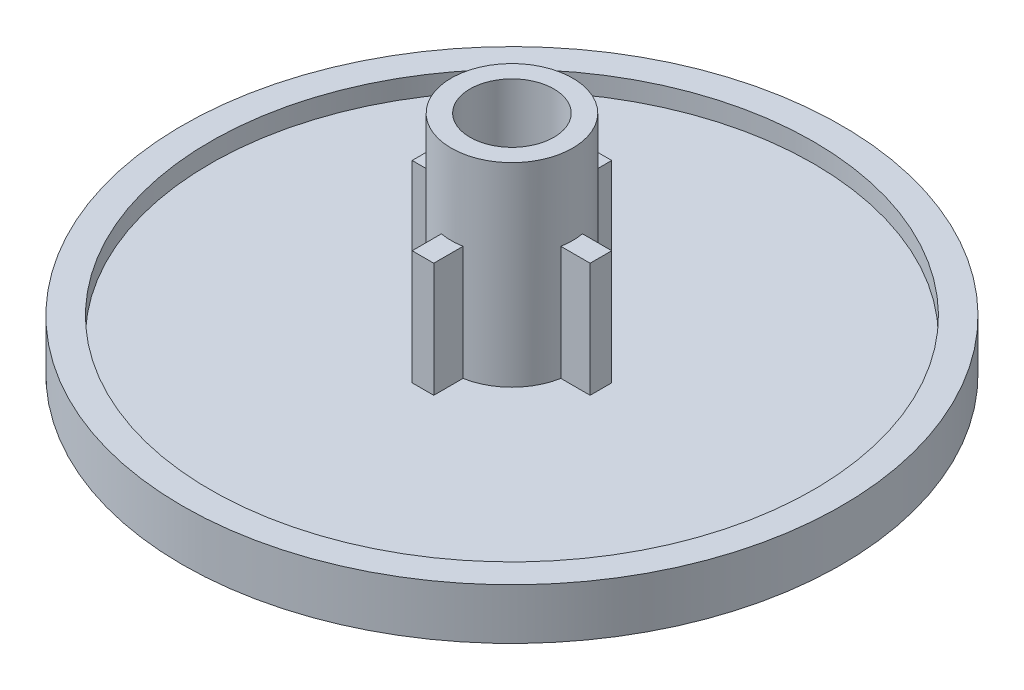
ISO-10303-21;
HEADER;
FILE_DESCRIPTION(('STEP AP214'),'2;1');
FILE_NAME('part.step','',(''),(''),'','','');
FILE_SCHEMA(('AUTOMOTIVE_DESIGN { 1 0 10303 214 1 1 1 1 }'));
ENDSEC;
DATA;
#1=APPLICATION_CONTEXT('core data for automotive mechanical design processes');
#2=APPLICATION_PROTOCOL_DEFINITION('international standard','automotive_design',2000,#1);
#3=PRODUCT_CONTEXT('',#1,'mechanical');
#4=PRODUCT('Part','Part','',(#3));
#5=PRODUCT_RELATED_PRODUCT_CATEGORY('part','',(#4));
#6=PRODUCT_DEFINITION_FORMATION('','',#4);
#7=PRODUCT_DEFINITION_CONTEXT('part definition',#1,'design');
#8=PRODUCT_DEFINITION('design','',#6,#7);
#9=PRODUCT_DEFINITION_SHAPE('','',#8);
#10=(LENGTH_UNIT() NAMED_UNIT(*) SI_UNIT(.MILLI.,.METRE.));
#11=(NAMED_UNIT(*) PLANE_ANGLE_UNIT() SI_UNIT($,.RADIAN.));
#12=(NAMED_UNIT(*) SI_UNIT($,.STERADIAN.) SOLID_ANGLE_UNIT());
#13=UNCERTAINTY_MEASURE_WITH_UNIT(LENGTH_MEASURE(1.E-05),#10,'distance_accuracy_value','');
#14=(GEOMETRIC_REPRESENTATION_CONTEXT(3) GLOBAL_UNCERTAINTY_ASSIGNED_CONTEXT((#13)) GLOBAL_UNIT_ASSIGNED_CONTEXT((#10,
#11,#12)) REPRESENTATION_CONTEXT('',''));
#15=CARTESIAN_POINT('',(0.,0.,0.));
#16=DIRECTION('',(0.,0.,1.));
#17=DIRECTION('',(1.,0.,0.));
#18=AXIS2_PLACEMENT_3D('',#15,#16,#17);
#19=CARTESIAN_POINT('',(0.,1.27,0.));
#20=DIRECTION('',(0.,1.,0.));
#21=DIRECTION('',(0.,0.,1.));
#22=AXIS2_PLACEMENT_3D('',#19,#20,#21);
#23=PLANE('',#22);
#24=CARTESIAN_POINT('',(0.,1.27,0.));
#25=DIRECTION('',(0.,1.,0.));
#26=DIRECTION('',(0.,0.,1.));
#27=AXIS2_PLACEMENT_3D('',#24,#25,#26);
#28=CIRCLE('',#27,12.0523);
#29=CARTESIAN_POINT('',(0.,1.27,-12.0523));
#30=VERTEX_POINT('',#29);
#31=EDGE_CURVE('E253',#30,#30,#28,.F.);
#32=ORIENTED_EDGE('',*,*,#31,.F.);
#33=EDGE_LOOP('',(#32));
#34=FACE_BOUND('',#33,.T.);
#35=DIRECTION('',(1.,0.,0.));
#36=VECTOR('',#35,1.);
#37=CARTESIAN_POINT('',(0.,1.27,-3.556));
#38=LINE('',#37,#36);
#39=CARTESIAN_POINT('',(-0.4318,1.27,-3.556));
#40=VERTEX_POINT('',#39);
#41=CARTESIAN_POINT('',(0.4318,1.27,-3.556));
#42=VERTEX_POINT('',#41);
#43=EDGE_CURVE('E199',#40,#42,#38,.T.);
#44=ORIENTED_EDGE('',*,*,#43,.T.);
#45=DIRECTION('',(0.,0.,1.));
#46=VECTOR('',#45,1.);
#47=CARTESIAN_POINT('',(0.4318,1.27,0.));
#48=LINE('',#47,#46);
#49=CARTESIAN_POINT('',(0.4318,1.27,-2.38695815840999));
#50=VERTEX_POINT('',#49);
#51=EDGE_CURVE('E156',#42,#50,#48,.T.);
#52=ORIENTED_EDGE('',*,*,#51,.T.);
#53=CARTESIAN_POINT('',(0.,1.27,0.));
#54=DIRECTION('',(0.,1.,0.));
#55=DIRECTION('',(0.,0.,1.));
#56=AXIS2_PLACEMENT_3D('',#53,#54,#55);
#57=CIRCLE('',#56,2.4257);
#58=CARTESIAN_POINT('',(2.38695815840999,1.27,-0.4318));
#59=VERTEX_POINT('',#58);
#60=EDGE_CURVE('E239',#59,#50,#57,.T.);
#61=ORIENTED_EDGE('',*,*,#60,.F.);
#62=DIRECTION('',(-1.,0.,0.));
#63=VECTOR('',#62,1.);
#64=CARTESIAN_POINT('',(0.,1.27,-0.4318));
#65=LINE('',#64,#63);
#66=CARTESIAN_POINT('',(3.556,1.27,-0.4318));
#67=VERTEX_POINT('',#66);
#68=EDGE_CURVE('E230',#67,#59,#65,.T.);
#69=ORIENTED_EDGE('',*,*,#68,.F.);
#70=DIRECTION('',(0.,0.,1.));
#71=VECTOR('',#70,1.);
#72=CARTESIAN_POINT('',(3.556,1.27,0.));
#73=LINE('',#72,#71);
#74=CARTESIAN_POINT('',(3.556,1.27,0.4318));
#75=VERTEX_POINT('',#74);
#76=EDGE_CURVE('E273',#67,#75,#73,.T.);
#77=ORIENTED_EDGE('',*,*,#76,.T.);
#78=DIRECTION('',(-1.,0.,0.));
#79=VECTOR('',#78,1.);
#80=CARTESIAN_POINT('',(0.,1.27,0.4318));
#81=LINE('',#80,#79);
#82=CARTESIAN_POINT('',(2.38695815840999,1.27,0.4318));
#83=VERTEX_POINT('',#82);
#84=EDGE_CURVE('E234',#75,#83,#81,.T.);
#85=ORIENTED_EDGE('',*,*,#84,.T.);
#86=CARTESIAN_POINT('',(0.4318,1.27,2.38695815840999));
#87=VERTEX_POINT('',#86);
#88=EDGE_CURVE('E244',#87,#83,#57,.T.);
#89=ORIENTED_EDGE('',*,*,#88,.F.);
#90=CARTESIAN_POINT('',(0.4318,1.27,3.556));
#91=VERTEX_POINT('',#90);
#92=EDGE_CURVE('E194',#87,#91,#48,.T.);
#93=ORIENTED_EDGE('',*,*,#92,.T.);
#94=DIRECTION('',(-1.,0.,0.));
#95=VECTOR('',#94,1.);
#96=CARTESIAN_POINT('',(0.,1.27,3.556));
#97=LINE('',#96,#95);
#98=CARTESIAN_POINT('',(-0.4318,1.27,3.556));
#99=VERTEX_POINT('',#98);
#100=EDGE_CURVE('E201',#91,#99,#97,.T.);
#101=ORIENTED_EDGE('',*,*,#100,.T.);
#102=DIRECTION('',(0.,0.,1.));
#103=VECTOR('',#102,1.);
#104=CARTESIAN_POINT('',(-0.4318,1.27,0.));
#105=LINE('',#104,#103);
#106=CARTESIAN_POINT('',(-0.4318,1.27,2.38695815840999));
#107=VERTEX_POINT('',#106);
#108=EDGE_CURVE('E188',#107,#99,#105,.T.);
#109=ORIENTED_EDGE('',*,*,#108,.F.);
#110=CARTESIAN_POINT('',(-2.38695815840999,1.27,0.4318));
#111=VERTEX_POINT('',#110);
#112=EDGE_CURVE('E240',#111,#107,#57,.T.);
#113=ORIENTED_EDGE('',*,*,#112,.F.);
#114=CARTESIAN_POINT('',(-3.556,1.27,0.4318));
#115=VERTEX_POINT('',#114);
#116=EDGE_CURVE('E231',#111,#115,#81,.T.);
#117=ORIENTED_EDGE('',*,*,#116,.T.);
#118=DIRECTION('',(0.,0.,-1.));
#119=VECTOR('',#118,1.);
#120=CARTESIAN_POINT('',(-3.556,1.27,0.));
#121=LINE('',#120,#119);
#122=CARTESIAN_POINT('',(-3.556,1.27,-0.4318));
#123=VERTEX_POINT('',#122);
#124=EDGE_CURVE('E271',#115,#123,#121,.T.);
#125=ORIENTED_EDGE('',*,*,#124,.T.);
#126=CARTESIAN_POINT('',(-2.38695815840999,1.27,-0.4318));
#127=VERTEX_POINT('',#126);
#128=EDGE_CURVE('E228',#127,#123,#65,.T.);
#129=ORIENTED_EDGE('',*,*,#128,.F.);
#130=CARTESIAN_POINT('',(-0.4318,1.27,-2.38695815840999));
#131=VERTEX_POINT('',#130);
#132=EDGE_CURVE('E243',#131,#127,#57,.T.);
#133=ORIENTED_EDGE('',*,*,#132,.F.);
#134=EDGE_CURVE('E59',#40,#131,#105,.T.);
#135=ORIENTED_EDGE('',*,*,#134,.F.);
#136=EDGE_LOOP('',(#44,#52,#61,#69,#77,#85,#89,#93,#101,#109,#113,#117,#125,#129,#133,#135));
#137=FACE_BOUND('',#136,.T.);
#138=ADVANCED_FACE('F36',(#34,#137),#23,.T.);
#139=CARTESIAN_POINT('',(0.,9.0424,0.));
#140=DIRECTION('',(0.,-1.,0.));
#141=DIRECTION('',(0.,0.,-1.));
#142=AXIS2_PLACEMENT_3D('',#139,#140,#141);
#143=CYLINDRICAL_SURFACE('',#142,2.4257);
#144=CARTESIAN_POINT('',(0.,9.0424,0.));
#145=DIRECTION('',(0.,1.,0.));
#146=DIRECTION('',(0.,0.,1.));
#147=AXIS2_PLACEMENT_3D('',#144,#145,#146);
#148=CIRCLE('',#147,2.4257);
#149=CARTESIAN_POINT('',(0.,9.0424,2.4257));
#150=VERTEX_POINT('',#149);
#151=EDGE_CURVE('E235',#150,#150,#148,.T.);
#152=ORIENTED_EDGE('',*,*,#151,.F.);
#153=EDGE_LOOP('',(#152));
#154=FACE_BOUND('',#153,.T.);
#155=DIRECTION('',(0.,-1.,0.));
#156=VECTOR('',#155,1.);
#157=CARTESIAN_POINT('',(0.4318,9.0424,-2.38695815840999));
#158=LINE('',#157,#156);
#159=CARTESIAN_POINT('',(0.4318,5.842,-2.38695815840999));
#160=VERTEX_POINT('',#159);
#161=EDGE_CURVE('E197',#160,#50,#158,.T.);
#162=ORIENTED_EDGE('',*,*,#161,.F.);
#163=CARTESIAN_POINT('',(0.,5.842,0.));
#164=DIRECTION('',(0.,-1.,0.));
#165=DIRECTION('',(0.,0.,-1.));
#166=AXIS2_PLACEMENT_3D('',#163,#164,#165);
#167=CIRCLE('',#166,2.4257);
#168=CARTESIAN_POINT('',(-0.4318,5.842,-2.38695815840999));
#169=VERTEX_POINT('',#168);
#170=EDGE_CURVE('E11',#169,#160,#167,.T.);
#171=ORIENTED_EDGE('',*,*,#170,.F.);
#172=DIRECTION('',(0.,-1.,0.));
#173=VECTOR('',#172,1.);
#174=CARTESIAN_POINT('',(-0.4318,9.0424,-2.38695815840999));
#175=LINE('',#174,#173);
#176=EDGE_CURVE('E190',#169,#131,#175,.T.);
#177=ORIENTED_EDGE('',*,*,#176,.T.);
#178=ORIENTED_EDGE('',*,*,#132,.T.);
#179=DIRECTION('',(0.,-1.,0.));
#180=VECTOR('',#179,1.);
#181=CARTESIAN_POINT('',(-2.38695815840999,9.0424,-0.4318));
#182=LINE('',#181,#180);
#183=CARTESIAN_POINT('',(-2.38695815840999,5.842,-0.4318));
#184=VERTEX_POINT('',#183);
#185=EDGE_CURVE('E256',#127,#184,#182,.F.);
#186=ORIENTED_EDGE('',*,*,#185,.T.);
#187=CARTESIAN_POINT('',(0.,5.842,0.));
#188=DIRECTION('',(0.,-1.,0.));
#189=DIRECTION('',(0.,0.,-1.));
#190=AXIS2_PLACEMENT_3D('',#187,#188,#189);
#191=CIRCLE('',#190,2.4257);
#192=CARTESIAN_POINT('',(-2.38695815840999,5.842,0.4318));
#193=VERTEX_POINT('',#192);
#194=EDGE_CURVE('E259',#193,#184,#191,.T.);
#195=ORIENTED_EDGE('',*,*,#194,.F.);
#196=DIRECTION('',(0.,-1.,0.));
#197=VECTOR('',#196,1.);
#198=CARTESIAN_POINT('',(-2.38695815840999,9.0424,0.4318));
#199=LINE('',#198,#197);
#200=EDGE_CURVE('E262',#111,#193,#199,.F.);
#201=ORIENTED_EDGE('',*,*,#200,.F.);
#202=ORIENTED_EDGE('',*,*,#112,.T.);
#203=DIRECTION('',(0.,-1.,0.));
#204=VECTOR('',#203,1.);
#205=CARTESIAN_POINT('',(-0.4318,9.0424,2.38695815840999));
#206=LINE('',#205,#204);
#207=CARTESIAN_POINT('',(-0.4318,5.842,2.38695815840999));
#208=VERTEX_POINT('',#207);
#209=EDGE_CURVE('E169',#107,#208,#206,.F.);
#210=ORIENTED_EDGE('',*,*,#209,.T.);
#211=CARTESIAN_POINT('',(0.4318,5.842,2.38695815840999));
#212=VERTEX_POINT('',#211);
#213=EDGE_CURVE('E40',#212,#208,#167,.T.);
#214=ORIENTED_EDGE('',*,*,#213,.F.);
#215=DIRECTION('',(0.,-1.,0.));
#216=VECTOR('',#215,1.);
#217=CARTESIAN_POINT('',(0.4318,9.0424,2.38695815840999));
#218=LINE('',#217,#216);
#219=EDGE_CURVE('E192',#87,#212,#218,.F.);
#220=ORIENTED_EDGE('',*,*,#219,.F.);
#221=ORIENTED_EDGE('',*,*,#88,.T.);
#222=DIRECTION('',(0.,-1.,0.));
#223=VECTOR('',#222,1.);
#224=CARTESIAN_POINT('',(2.38695815840999,9.0424,0.4318));
#225=LINE('',#224,#223);
#226=CARTESIAN_POINT('',(2.38695815840999,5.842,0.4318));
#227=VERTEX_POINT('',#226);
#228=EDGE_CURVE('E268',#227,#83,#225,.T.);
#229=ORIENTED_EDGE('',*,*,#228,.F.);
#230=CARTESIAN_POINT('',(2.38695815840999,5.842,-0.4318));
#231=VERTEX_POINT('',#230);
#232=EDGE_CURVE('E263',#231,#227,#191,.T.);
#233=ORIENTED_EDGE('',*,*,#232,.F.);
#234=DIRECTION('',(0.,-1.,0.));
#235=VECTOR('',#234,1.);
#236=CARTESIAN_POINT('',(2.38695815840999,9.0424,-0.4318));
#237=LINE('',#236,#235);
#238=EDGE_CURVE('E265',#231,#59,#237,.T.);
#239=ORIENTED_EDGE('',*,*,#238,.T.);
#240=ORIENTED_EDGE('',*,*,#60,.T.);
#241=EDGE_LOOP('',(#162,#171,#177,#178,#186,#195,#201,#202,#210,#214,#220,#221,#229,#233,#239,#240));
#242=FACE_BOUND('',#241,.T.);
#243=ADVANCED_FACE('F285',(#154,#242),#143,.T.);
#244=CARTESIAN_POINT('',(0.,1.27,0.));
#245=DIRECTION('',(0.,-1.,0.));
#246=DIRECTION('',(0.,0.,-1.));
#247=AXIS2_PLACEMENT_3D('',#244,#245,#246);
#248=CYLINDRICAL_SURFACE('',#247,13.1699);
#249=CARTESIAN_POINT('',(0.,0.,0.));
#250=DIRECTION('',(0.,1.,0.));
#251=DIRECTION('',(0.,0.,1.));
#252=AXIS2_PLACEMENT_3D('',#249,#250,#251);
#253=CIRCLE('',#252,13.1699);
#254=CARTESIAN_POINT('',(0.,0.,13.1699));
#255=VERTEX_POINT('',#254);
#256=EDGE_CURVE('E250',#255,#255,#253,.T.);
#257=ORIENTED_EDGE('',*,*,#256,.T.);
#258=EDGE_LOOP('',(#257));
#259=FACE_BOUND('',#258,.T.);
#260=CARTESIAN_POINT('',(0.,2.032,0.));
#261=DIRECTION('',(0.,1.,0.));
#262=DIRECTION('',(0.,0.,1.));
#263=AXIS2_PLACEMENT_3D('',#260,#261,#262);
#264=CIRCLE('',#263,13.1699);
#265=CARTESIAN_POINT('',(0.,2.032,13.1699));
#266=VERTEX_POINT('',#265);
#267=EDGE_CURVE('E247',#266,#266,#264,.T.);
#268=ORIENTED_EDGE('',*,*,#267,.F.);
#269=EDGE_LOOP('',(#268));
#270=FACE_BOUND('',#269,.T.);
#271=ADVANCED_FACE('F38',(#259,#270),#248,.T.);
#272=CARTESIAN_POINT('',(0.,0.,0.));
#273=DIRECTION('',(0.,1.,0.));
#274=DIRECTION('',(0.,0.,1.));
#275=AXIS2_PLACEMENT_3D('',#272,#273,#274);
#276=PLANE('',#275);
#277=ORIENTED_EDGE('',*,*,#256,.F.);
#278=EDGE_LOOP('',(#277));
#279=FACE_BOUND('',#278,.T.);
#280=ADVANCED_FACE('F320',(#279),#276,.F.);
#281=CARTESIAN_POINT('',(0.,2.032,0.));
#282=DIRECTION('',(0.,1.,0.));
#283=DIRECTION('',(0.,0.,1.));
#284=AXIS2_PLACEMENT_3D('',#281,#282,#283);
#285=PLANE('',#284);
#286=ORIENTED_EDGE('',*,*,#267,.T.);
#287=EDGE_LOOP('',(#286));
#288=FACE_BOUND('',#287,.T.);
#289=CARTESIAN_POINT('',(0.,2.032,0.));
#290=DIRECTION('',(0.,1.,0.));
#291=DIRECTION('',(0.,0.,1.));
#292=AXIS2_PLACEMENT_3D('',#289,#290,#291);
#293=CIRCLE('',#292,12.0523);
#294=CARTESIAN_POINT('',(0.,2.032,-12.0523));
#295=VERTEX_POINT('',#294);
#296=EDGE_CURVE('E238',#295,#295,#293,.T.);
#297=ORIENTED_EDGE('',*,*,#296,.F.);
#298=EDGE_LOOP('',(#297));
#299=FACE_BOUND('',#298,.T.);
#300=ADVANCED_FACE('F328',(#288,#299),#285,.T.);
#301=CARTESIAN_POINT('',(0.,2.032,0.));
#302=DIRECTION('',(0.,-1.,0.));
#303=DIRECTION('',(0.,0.,-1.));
#304=AXIS2_PLACEMENT_3D('',#301,#302,#303);
#305=CYLINDRICAL_SURFACE('',#304,12.0523);
#306=CARTESIAN_POINT('',(0.,2.032,-12.0523));
#307=CARTESIAN_POINT('',(0.,2.0240625,-12.0523));
#308=CARTESIAN_POINT('',(0.,2.016125,-12.0523));
#309=CARTESIAN_POINT('',(0.,2.00025,-12.0523));
#310=CARTESIAN_POINT('',(0.,1.9923125,-12.0523));
#311=CARTESIAN_POINT('',(0.,1.9764375,-12.0523));
#312=CARTESIAN_POINT('',(0.,1.9685,-12.0523));
#313=CARTESIAN_POINT('',(0.,1.952625,-12.0523));
#314=CARTESIAN_POINT('',(0.,1.9446875,-12.0523));
#315=CARTESIAN_POINT('',(0.,1.9288125,-12.0523));
#316=CARTESIAN_POINT('',(0.,1.920875,-12.0523));
#317=CARTESIAN_POINT('',(0.,1.905,-12.0523));
#318=CARTESIAN_POINT('',(0.,1.8970625,-12.0523));
#319=CARTESIAN_POINT('',(0.,1.8811875,-12.0523));
#320=CARTESIAN_POINT('',(0.,1.87325,-12.0523));
#321=CARTESIAN_POINT('',(0.,1.857375,-12.0523));
#322=CARTESIAN_POINT('',(0.,1.8494375,-12.0523));
#323=CARTESIAN_POINT('',(0.,1.8335625,-12.0523));
#324=CARTESIAN_POINT('',(0.,1.825625,-12.0523));
#325=CARTESIAN_POINT('',(0.,1.80975,-12.0523));
#326=CARTESIAN_POINT('',(0.,1.8018125,-12.0523));
#327=CARTESIAN_POINT('',(0.,1.7859375,-12.0523));
#328=CARTESIAN_POINT('',(0.,1.778,-12.0523));
#329=CARTESIAN_POINT('',(0.,1.762125,-12.0523));
#330=CARTESIAN_POINT('',(0.,1.7541875,-12.0523));
#331=CARTESIAN_POINT('',(0.,1.7383125,-12.0523));
#332=CARTESIAN_POINT('',(0.,1.730375,-12.0523));
#333=CARTESIAN_POINT('',(0.,1.7145,-12.0523));
#334=CARTESIAN_POINT('',(0.,1.7065625,-12.0523));
#335=CARTESIAN_POINT('',(0.,1.6906875,-12.0523));
#336=CARTESIAN_POINT('',(0.,1.68275,-12.0523));
#337=CARTESIAN_POINT('',(0.,1.666875,-12.0523));
#338=CARTESIAN_POINT('',(0.,1.6589375,-12.0523));
#339=CARTESIAN_POINT('',(0.,1.6430625,-12.0523));
#340=CARTESIAN_POINT('',(0.,1.635125,-12.0523));
#341=CARTESIAN_POINT('',(0.,1.61925,-12.0523));
#342=CARTESIAN_POINT('',(0.,1.6113125,-12.0523));
#343=CARTESIAN_POINT('',(0.,1.5954375,-12.0523));
#344=CARTESIAN_POINT('',(0.,1.5875,-12.0523));
#345=CARTESIAN_POINT('',(0.,1.571625,-12.0523));
#346=CARTESIAN_POINT('',(0.,1.5636875,-12.0523));
#347=CARTESIAN_POINT('',(0.,1.5478125,-12.0523));
#348=CARTESIAN_POINT('',(0.,1.539875,-12.0523));
#349=CARTESIAN_POINT('',(0.,1.524,-12.0523));
#350=CARTESIAN_POINT('',(0.,1.5160625,-12.0523));
#351=CARTESIAN_POINT('',(0.,1.5001875,-12.0523));
#352=CARTESIAN_POINT('',(0.,1.49225,-12.0523));
#353=CARTESIAN_POINT('',(0.,1.476375,-12.0523));
#354=CARTESIAN_POINT('',(0.,1.4684375,-12.0523));
#355=CARTESIAN_POINT('',(0.,1.4525625,-12.0523));
#356=CARTESIAN_POINT('',(0.,1.444625,-12.0523));
#357=CARTESIAN_POINT('',(0.,1.42875,-12.0523));
#358=CARTESIAN_POINT('',(0.,1.4208125,-12.0523));
#359=CARTESIAN_POINT('',(0.,1.4049375,-12.0523));
#360=CARTESIAN_POINT('',(0.,1.397,-12.0523));
#361=CARTESIAN_POINT('',(0.,1.381125,-12.0523));
#362=CARTESIAN_POINT('',(0.,1.3731875,-12.0523));
#363=CARTESIAN_POINT('',(0.,1.3573125,-12.0523));
#364=CARTESIAN_POINT('',(0.,1.349375,-12.0523));
#365=CARTESIAN_POINT('',(0.,1.3335,-12.0523));
#366=CARTESIAN_POINT('',(0.,1.3255625,-12.0523));
#367=CARTESIAN_POINT('',(0.,1.3096875,-12.0523));
#368=CARTESIAN_POINT('',(0.,1.30175,-12.0523));
#369=CARTESIAN_POINT('',(0.,1.285875,-12.0523));
#370=CARTESIAN_POINT('',(0.,1.2779375,-12.0523));
#371=CARTESIAN_POINT('',(0.,1.27,-12.0523));
#372=B_SPLINE_CURVE_WITH_KNOTS('',3,(#306,#307,#308,#309,#310,#311,#312,#313,#314,#315,#316,
#317,#318,#319,#320,#321,#322,#323,#324,#325,#326,#327,#328,#329,#330,#331,#332,#333,#334,#335,
#336,#337,#338,#339,#340,#341,#342,#343,#344,#345,#346,#347,#348,#349,#350,#351,#352,#353,#354,
#355,#356,#357,#358,#359,#360,#361,#362,#363,#364,#365,#366,#367,#368,#369,#370,#371),
.UNSPECIFIED.,.F.,.F.,(4,2,2,2,2,2,2,2,2,2,2,2,2,2,2,2,2,2,2,2,2,2,2,2,2,2,2,2,2,2,2,2,4),(0.,
0.0238125000000004,0.0476250000000004,0.0714375000000003,0.0952500000000003,0.1190625,0.142875,
0.1666875,0.1905,0.2143125,0.238125,0.2619375,0.28575,0.3095625,0.333375,0.3571875,0.381,
0.4048125,0.428625,0.4524375,0.47625,0.5000625,0.523875,0.5476875,0.5715,0.5953125,0.619125,
0.6429375,0.66675,0.6905625,0.714375,0.7381875,0.762),.UNSPECIFIED.);
#373=EDGE_CURVE('BSEAM310',#295,#30,#372,.T.);
#374=ORIENTED_EDGE('',*,*,#296,.T.);
#375=ORIENTED_EDGE('',*,*,#31,.T.);
#376=ORIENTED_EDGE('',*,*,#373,.T.);
#377=ORIENTED_EDGE('',*,*,#373,.F.);
#378=EDGE_LOOP('',(#374,#376,#375,#377));
#379=FACE_BOUND('',#378,.T.);
#380=ADVANCED_FACE('F310',(#379),#305,.F.);
#381=CARTESIAN_POINT('',(0.,9.0424,0.));
#382=DIRECTION('',(0.,1.,0.));
#383=DIRECTION('',(0.,0.,1.));
#384=AXIS2_PLACEMENT_3D('',#381,#382,#383);
#385=PLANE('',#384);
#386=CARTESIAN_POINT('',(0.,9.0424,0.));
#387=DIRECTION('',(0.,1.,0.));
#388=DIRECTION('',(0.,0.,1.));
#389=AXIS2_PLACEMENT_3D('',#386,#387,#388);
#390=CIRCLE('',#389,1.6764);
#391=CARTESIAN_POINT('',(0.,9.0424,1.6764));
#392=VERTEX_POINT('',#391);
#393=EDGE_CURVE('E300',#392,#392,#390,.T.);
#394=ORIENTED_EDGE('',*,*,#393,.F.);
#395=EDGE_LOOP('',(#394));
#396=FACE_BOUND('',#395,.T.);
#397=ORIENTED_EDGE('',*,*,#151,.T.);
#398=EDGE_LOOP('',(#397));
#399=FACE_BOUND('',#398,.T.);
#400=ADVANCED_FACE('F306',(#396,#399),#385,.T.);
#401=CARTESIAN_POINT('',(0.,0.,-0.4318));
#402=DIRECTION('',(0.,0.,-1.));
#403=DIRECTION('',(-1.,0.,0.));
#404=AXIS2_PLACEMENT_3D('',#401,#402,#403);
#405=PLANE('',#404);
#406=ORIENTED_EDGE('',*,*,#185,.F.);
#407=ORIENTED_EDGE('',*,*,#128,.T.);
#408=DIRECTION('',(0.,-1.,0.));
#409=VECTOR('',#408,1.);
#410=CARTESIAN_POINT('',(-3.556,0.,-0.4318));
#411=LINE('',#410,#409);
#412=CARTESIAN_POINT('',(-3.556,5.842,-0.4318));
#413=VERTEX_POINT('',#412);
#414=EDGE_CURVE('E204',#413,#123,#411,.T.);
#415=ORIENTED_EDGE('',*,*,#414,.F.);
#416=DIRECTION('',(-1.,0.,0.));
#417=VECTOR('',#416,1.);
#418=CARTESIAN_POINT('',(-3.556,5.842,-0.4318));
#419=LINE('',#418,#417);
#420=EDGE_CURVE('E220',#184,#413,#419,.T.);
#421=ORIENTED_EDGE('',*,*,#420,.F.);
#422=EDGE_LOOP('',(#406,#407,#415,#421));
#423=FACE_BOUND('',#422,.T.);
#424=ADVANCED_FACE('F309',(#423),#405,.T.);
#425=CARTESIAN_POINT('',(0.,0.,0.4318));
#426=DIRECTION('',(0.,0.,-1.));
#427=DIRECTION('',(-1.,0.,0.));
#428=AXIS2_PLACEMENT_3D('',#425,#426,#427);
#429=PLANE('',#428);
#430=ORIENTED_EDGE('',*,*,#116,.F.);
#431=ORIENTED_EDGE('',*,*,#200,.T.);
#432=DIRECTION('',(-1.,0.,0.));
#433=VECTOR('',#432,1.);
#434=CARTESIAN_POINT('',(-3.556,5.842,0.4318));
#435=LINE('',#434,#433);
#436=CARTESIAN_POINT('',(-3.556,5.842,0.4318));
#437=VERTEX_POINT('',#436);
#438=EDGE_CURVE('E211',#193,#437,#435,.T.);
#439=ORIENTED_EDGE('',*,*,#438,.T.);
#440=DIRECTION('',(0.,-1.,0.));
#441=VECTOR('',#440,1.);
#442=CARTESIAN_POINT('',(-3.556,0.,0.4318));
#443=LINE('',#442,#441);
#444=EDGE_CURVE('E205',#437,#115,#443,.T.);
#445=ORIENTED_EDGE('',*,*,#444,.T.);
#446=EDGE_LOOP('',(#430,#431,#439,#445));
#447=FACE_BOUND('',#446,.T.);
#448=ADVANCED_FACE('F366',(#447),#429,.F.);
#449=CARTESIAN_POINT('',(-3.556,5.842,0.4318));
#450=DIRECTION('',(0.,-1.,0.));
#451=DIRECTION('',(0.,0.,-1.));
#452=AXIS2_PLACEMENT_3D('',#449,#450,#451);
#453=PLANE('',#452);
#454=ORIENTED_EDGE('',*,*,#438,.F.);
#455=ORIENTED_EDGE('',*,*,#194,.T.);
#456=ORIENTED_EDGE('',*,*,#420,.T.);
#457=DIRECTION('',(0.,0.,-1.));
#458=VECTOR('',#457,1.);
#459=CARTESIAN_POINT('',(-3.556,5.842,0.4318));
#460=LINE('',#459,#458);
#461=EDGE_CURVE('E215',#437,#413,#460,.T.);
#462=ORIENTED_EDGE('',*,*,#461,.F.);
#463=EDGE_LOOP('',(#454,#455,#456,#462));
#464=FACE_BOUND('',#463,.T.);
#465=ADVANCED_FACE('F375',(#464),#453,.F.);
#466=CARTESIAN_POINT('',(-3.556,0.,0.4318));
#467=DIRECTION('',(1.,0.,0.));
#468=DIRECTION('',(0.,0.,-1.));
#469=AXIS2_PLACEMENT_3D('',#466,#467,#468);
#470=PLANE('',#469);
#471=ORIENTED_EDGE('',*,*,#124,.F.);
#472=ORIENTED_EDGE('',*,*,#444,.F.);
#473=ORIENTED_EDGE('',*,*,#461,.T.);
#474=ORIENTED_EDGE('',*,*,#414,.T.);
#475=EDGE_LOOP('',(#471,#472,#473,#474));
#476=FACE_BOUND('',#475,.T.);
#477=ADVANCED_FACE('F384',(#476),#470,.F.);
#478=CARTESIAN_POINT('',(3.556,5.842,-0.4318));
#479=VERTEX_POINT('',#478);
#480=EDGE_CURVE('E209',#479,#231,#419,.T.);
#481=ORIENTED_EDGE('',*,*,#480,.T.);
#482=ORIENTED_EDGE('',*,*,#232,.T.);
#483=CARTESIAN_POINT('',(3.556,5.842,0.4318));
#484=VERTEX_POINT('',#483);
#485=EDGE_CURVE('E212',#484,#227,#435,.T.);
#486=ORIENTED_EDGE('',*,*,#485,.F.);
#487=DIRECTION('',(0.,0.,-1.));
#488=VECTOR('',#487,1.);
#489=CARTESIAN_POINT('',(3.556,5.842,0.4318));
#490=LINE('',#489,#488);
#491=EDGE_CURVE('E225',#484,#479,#490,.T.);
#492=ORIENTED_EDGE('',*,*,#491,.T.);
#493=EDGE_LOOP('',(#481,#482,#486,#492));
#494=FACE_BOUND('',#493,.T.);
#495=ADVANCED_FACE('F387',(#494),#453,.F.);
#496=ORIENTED_EDGE('',*,*,#84,.F.);
#497=DIRECTION('',(0.,1.,0.));
#498=VECTOR('',#497,1.);
#499=CARTESIAN_POINT('',(3.556,0.,0.4318));
#500=LINE('',#499,#498);
#501=EDGE_CURVE('E208',#75,#484,#500,.T.);
#502=ORIENTED_EDGE('',*,*,#501,.T.);
#503=ORIENTED_EDGE('',*,*,#485,.T.);
#504=ORIENTED_EDGE('',*,*,#228,.T.);
#505=EDGE_LOOP('',(#496,#502,#503,#504));
#506=FACE_BOUND('',#505,.T.);
#507=ADVANCED_FACE('F378',(#506),#429,.F.);
#508=DIRECTION('',(0.,1.,0.));
#509=VECTOR('',#508,1.);
#510=CARTESIAN_POINT('',(3.556,0.,-0.4318));
#511=LINE('',#510,#509);
#512=EDGE_CURVE('E218',#67,#479,#511,.T.);
#513=ORIENTED_EDGE('',*,*,#512,.F.);
#514=ORIENTED_EDGE('',*,*,#68,.T.);
#515=ORIENTED_EDGE('',*,*,#238,.F.);
#516=ORIENTED_EDGE('',*,*,#480,.F.);
#517=EDGE_LOOP('',(#513,#514,#515,#516));
#518=FACE_BOUND('',#517,.T.);
#519=ADVANCED_FACE('F369',(#518),#405,.T.);
#520=CARTESIAN_POINT('',(3.556,0.,0.4318));
#521=DIRECTION('',(-1.,0.,0.));
#522=DIRECTION('',(0.,0.,1.));
#523=AXIS2_PLACEMENT_3D('',#520,#521,#522);
#524=PLANE('',#523);
#525=ORIENTED_EDGE('',*,*,#76,.F.);
#526=ORIENTED_EDGE('',*,*,#512,.T.);
#527=ORIENTED_EDGE('',*,*,#491,.F.);
#528=ORIENTED_EDGE('',*,*,#501,.F.);
#529=EDGE_LOOP('',(#525,#526,#527,#528));
#530=FACE_BOUND('',#529,.T.);
#531=ADVANCED_FACE('F411',(#530),#524,.F.);
#532=CARTESIAN_POINT('',(-0.4318,0.,0.));
#533=DIRECTION('',(-1.,0.,0.));
#534=DIRECTION('',(0.,0.,1.));
#535=AXIS2_PLACEMENT_3D('',#532,#533,#534);
#536=PLANE('',#535);
#537=ORIENTED_EDGE('',*,*,#209,.F.);
#538=ORIENTED_EDGE('',*,*,#108,.T.);
#539=DIRECTION('',(0.,-1.,0.));
#540=VECTOR('',#539,1.);
#541=CARTESIAN_POINT('',(-0.4318,0.,3.556));
#542=LINE('',#541,#540);
#543=CARTESIAN_POINT('',(-0.4318,5.842,3.556));
#544=VERTEX_POINT('',#543);
#545=EDGE_CURVE('E179',#544,#99,#542,.T.);
#546=ORIENTED_EDGE('',*,*,#545,.F.);
#547=DIRECTION('',(0.,0.,1.));
#548=VECTOR('',#547,1.);
#549=CARTESIAN_POINT('',(-0.4318,5.842,3.556));
#550=LINE('',#549,#548);
#551=EDGE_CURVE('E51',#208,#544,#550,.T.);
#552=ORIENTED_EDGE('',*,*,#551,.F.);
#553=EDGE_LOOP('',(#537,#538,#546,#552));
#554=FACE_BOUND('',#553,.T.);
#555=ADVANCED_FACE('F289',(#554),#536,.T.);
#556=CARTESIAN_POINT('',(0.4318,0.,0.));
#557=DIRECTION('',(-1.,0.,0.));
#558=DIRECTION('',(0.,0.,1.));
#559=AXIS2_PLACEMENT_3D('',#556,#557,#558);
#560=PLANE('',#559);
#561=ORIENTED_EDGE('',*,*,#92,.F.);
#562=ORIENTED_EDGE('',*,*,#219,.T.);
#563=DIRECTION('',(0.,0.,1.));
#564=VECTOR('',#563,1.);
#565=CARTESIAN_POINT('',(0.4318,5.842,3.556));
#566=LINE('',#565,#564);
#567=CARTESIAN_POINT('',(0.4318,5.842,3.556));
#568=VERTEX_POINT('',#567);
#569=EDGE_CURVE('E159',#212,#568,#566,.T.);
#570=ORIENTED_EDGE('',*,*,#569,.T.);
#571=DIRECTION('',(0.,-1.,0.));
#572=VECTOR('',#571,1.);
#573=CARTESIAN_POINT('',(0.4318,0.,3.556));
#574=LINE('',#573,#572);
#575=EDGE_CURVE('E160',#568,#91,#574,.T.);
#576=ORIENTED_EDGE('',*,*,#575,.T.);
#577=EDGE_LOOP('',(#561,#562,#570,#576));
#578=FACE_BOUND('',#577,.T.);
#579=ADVANCED_FACE('F296',(#578),#560,.F.);
#580=CARTESIAN_POINT('',(0.4318,5.842,3.556));
#581=DIRECTION('',(0.,-1.,0.));
#582=DIRECTION('',(0.,0.,-1.));
#583=AXIS2_PLACEMENT_3D('',#580,#581,#582);
#584=PLANE('',#583);
#585=ORIENTED_EDGE('',*,*,#569,.F.);
#586=ORIENTED_EDGE('',*,*,#213,.T.);
#587=ORIENTED_EDGE('',*,*,#551,.T.);
#588=DIRECTION('',(-1.,0.,0.));
#589=VECTOR('',#588,1.);
#590=CARTESIAN_POINT('',(0.4318,5.842,3.556));
#591=LINE('',#590,#589);
#592=EDGE_CURVE('E170',#568,#544,#591,.T.);
#593=ORIENTED_EDGE('',*,*,#592,.F.);
#594=EDGE_LOOP('',(#585,#586,#587,#593));
#595=FACE_BOUND('',#594,.T.);
#596=ADVANCED_FACE('F281',(#595),#584,.F.);
#597=CARTESIAN_POINT('',(0.4318,0.,3.556));
#598=DIRECTION('',(0.,0.,-1.));
#599=DIRECTION('',(-1.,0.,0.));
#600=AXIS2_PLACEMENT_3D('',#597,#598,#599);
#601=PLANE('',#600);
#602=ORIENTED_EDGE('',*,*,#100,.F.);
#603=ORIENTED_EDGE('',*,*,#575,.F.);
#604=ORIENTED_EDGE('',*,*,#592,.T.);
#605=ORIENTED_EDGE('',*,*,#545,.T.);
#606=EDGE_LOOP('',(#602,#603,#604,#605));
#607=FACE_BOUND('',#606,.T.);
#608=ADVANCED_FACE('F294',(#607),#601,.F.);
#609=ORIENTED_EDGE('',*,*,#51,.F.);
#610=DIRECTION('',(0.,1.,0.));
#611=VECTOR('',#610,1.);
#612=CARTESIAN_POINT('',(0.4318,0.,-3.556));
#613=LINE('',#612,#611);
#614=CARTESIAN_POINT('',(0.4318,5.842,-3.556));
#615=VERTEX_POINT('',#614);
#616=EDGE_CURVE('E149',#42,#615,#613,.T.);
#617=ORIENTED_EDGE('',*,*,#616,.T.);
#618=EDGE_CURVE('E153',#615,#160,#566,.T.);
#619=ORIENTED_EDGE('',*,*,#618,.T.);
#620=ORIENTED_EDGE('',*,*,#161,.T.);
#621=EDGE_LOOP('',(#609,#617,#619,#620));
#622=FACE_BOUND('',#621,.T.);
#623=ADVANCED_FACE('F151',(#622),#560,.F.);
#624=DIRECTION('',(0.,1.,0.));
#625=VECTOR('',#624,1.);
#626=CARTESIAN_POINT('',(-0.4318,0.,-3.556));
#627=LINE('',#626,#625);
#628=CARTESIAN_POINT('',(-0.4318,5.842,-3.556));
#629=VERTEX_POINT('',#628);
#630=EDGE_CURVE('E165',#40,#629,#627,.T.);
#631=ORIENTED_EDGE('',*,*,#630,.F.);
#632=ORIENTED_EDGE('',*,*,#134,.T.);
#633=ORIENTED_EDGE('',*,*,#176,.F.);
#634=EDGE_CURVE('E184',#629,#169,#550,.T.);
#635=ORIENTED_EDGE('',*,*,#634,.F.);
#636=EDGE_LOOP('',(#631,#632,#633,#635));
#637=FACE_BOUND('',#636,.T.);
#638=ADVANCED_FACE('F426',(#637),#536,.T.);
#639=CARTESIAN_POINT('',(0.4318,0.,-3.556));
#640=DIRECTION('',(0.,0.,1.));
#641=DIRECTION('',(1.,0.,0.));
#642=AXIS2_PLACEMENT_3D('',#639,#640,#641);
#643=PLANE('',#642);
#644=ORIENTED_EDGE('',*,*,#43,.F.);
#645=ORIENTED_EDGE('',*,*,#630,.T.);
#646=DIRECTION('',(-1.,0.,0.));
#647=VECTOR('',#646,1.);
#648=CARTESIAN_POINT('',(0.4318,5.842,-3.556));
#649=LINE('',#648,#647);
#650=EDGE_CURVE('E163',#615,#629,#649,.T.);
#651=ORIENTED_EDGE('',*,*,#650,.F.);
#652=ORIENTED_EDGE('',*,*,#616,.F.);
#653=EDGE_LOOP('',(#644,#645,#651,#652));
#654=FACE_BOUND('',#653,.T.);
#655=ADVANCED_FACE('F164',(#654),#643,.F.);
#656=ORIENTED_EDGE('',*,*,#634,.T.);
#657=ORIENTED_EDGE('',*,*,#170,.T.);
#658=ORIENTED_EDGE('',*,*,#618,.F.);
#659=ORIENTED_EDGE('',*,*,#650,.T.);
#660=EDGE_LOOP('',(#656,#657,#658,#659));
#661=FACE_BOUND('',#660,.T.);
#662=ADVANCED_FACE('F172',(#661),#584,.F.);
#663=CARTESIAN_POINT('',(0.,-3.47157523192451,0.));
#664=DIRECTION('',(0.,1.,0.));
#665=DIRECTION('',(0.,0.,1.));
#666=AXIS2_PLACEMENT_3D('',#663,#664,#665);
#667=CYLINDRICAL_SURFACE('',#666,1.6764);
#668=CARTESIAN_POINT('',(0.,1.27,0.));
#669=DIRECTION('',(0.,1.,0.));
#670=DIRECTION('',(0.,0.,1.));
#671=AXIS2_PLACEMENT_3D('',#668,#669,#670);
#672=CIRCLE('',#671,1.6764);
#673=CARTESIAN_POINT('',(0.,1.27,1.6764));
#674=VERTEX_POINT('',#673);
#675=EDGE_CURVE('E182',#674,#674,#672,.F.);
#676=CARTESIAN_POINT('',(0.,1.27,1.6764));
#677=CARTESIAN_POINT('',(0.,1.3509625,1.6764));
#678=CARTESIAN_POINT('',(0.,1.431925,1.6764));
#679=CARTESIAN_POINT('',(0.,1.59385,1.6764));
#680=CARTESIAN_POINT('',(0.,1.6748125,1.6764));
#681=CARTESIAN_POINT('',(0.,1.8367375,1.6764));
#682=CARTESIAN_POINT('',(0.,1.9177,1.6764));
#683=CARTESIAN_POINT('',(0.,2.079625,1.6764));
#684=CARTESIAN_POINT('',(0.,2.1605875,1.6764));
#685=CARTESIAN_POINT('',(0.,2.3225125,1.6764));
#686=CARTESIAN_POINT('',(0.,2.403475,1.6764));
#687=CARTESIAN_POINT('',(0.,2.5654,1.6764));
#688=CARTESIAN_POINT('',(0.,2.6463625,1.6764));
#689=CARTESIAN_POINT('',(0.,2.8082875,1.6764));
#690=CARTESIAN_POINT('',(0.,2.88925,1.6764));
#691=CARTESIAN_POINT('',(0.,3.051175,1.6764));
#692=CARTESIAN_POINT('',(0.,3.1321375,1.6764));
#693=CARTESIAN_POINT('',(0.,3.2940625,1.6764));
#694=CARTESIAN_POINT('',(0.,3.375025,1.6764));
#695=CARTESIAN_POINT('',(0.,3.53695,1.6764));
#696=CARTESIAN_POINT('',(0.,3.6179125,1.6764));
#697=CARTESIAN_POINT('',(0.,3.7798375,1.6764));
#698=CARTESIAN_POINT('',(0.,3.8608,1.6764));
#699=CARTESIAN_POINT('',(0.,4.022725,1.6764));
#700=CARTESIAN_POINT('',(0.,4.1036875,1.6764));
#701=CARTESIAN_POINT('',(0.,4.2656125,1.6764));
#702=CARTESIAN_POINT('',(0.,4.346575,1.6764));
#703=CARTESIAN_POINT('',(0.,4.5085,1.6764));
#704=CARTESIAN_POINT('',(0.,4.5894625,1.6764));
#705=CARTESIAN_POINT('',(0.,4.7513875,1.6764));
#706=CARTESIAN_POINT('',(0.,4.83235,1.6764));
#707=CARTESIAN_POINT('',(0.,4.994275,1.6764));
#708=CARTESIAN_POINT('',(0.,5.0752375,1.6764));
#709=CARTESIAN_POINT('',(0.,5.2371625,1.6764));
#710=CARTESIAN_POINT('',(0.,5.318125,1.6764));
#711=CARTESIAN_POINT('',(0.,5.48005,1.6764));
#712=CARTESIAN_POINT('',(0.,5.5610125,1.6764));
#713=CARTESIAN_POINT('',(0.,5.7229375,1.6764));
#714=CARTESIAN_POINT('',(0.,5.8039,1.6764));
#715=CARTESIAN_POINT('',(0.,5.965825,1.6764));
#716=CARTESIAN_POINT('',(0.,6.0467875,1.6764));
#717=CARTESIAN_POINT('',(0.,6.2087125,1.6764));
#718=CARTESIAN_POINT('',(0.,6.289675,1.6764));
#719=CARTESIAN_POINT('',(0.,6.4516,1.6764));
#720=CARTESIAN_POINT('',(0.,6.5325625,1.6764));
#721=CARTESIAN_POINT('',(0.,6.6944875,1.6764));
#722=CARTESIAN_POINT('',(0.,6.77545,1.6764));
#723=CARTESIAN_POINT('',(0.,6.937375,1.6764));
#724=CARTESIAN_POINT('',(0.,7.0183375,1.6764));
#725=CARTESIAN_POINT('',(0.,7.1802625,1.6764));
#726=CARTESIAN_POINT('',(0.,7.261225,1.6764));
#727=CARTESIAN_POINT('',(0.,7.42315,1.6764));
#728=CARTESIAN_POINT('',(0.,7.5041125,1.6764));
#729=CARTESIAN_POINT('',(0.,7.6660375,1.6764));
#730=CARTESIAN_POINT('',(0.,7.747,1.6764));
#731=CARTESIAN_POINT('',(0.,7.908925,1.6764));
#732=CARTESIAN_POINT('',(0.,7.9898875,1.6764));
#733=CARTESIAN_POINT('',(0.,8.1518125,1.6764));
#734=CARTESIAN_POINT('',(0.,8.232775,1.6764));
#735=CARTESIAN_POINT('',(0.,8.3947,1.6764));
#736=CARTESIAN_POINT('',(0.,8.4756625,1.6764));
#737=CARTESIAN_POINT('',(0.,8.6375875,1.6764));
#738=CARTESIAN_POINT('',(0.,8.71855,1.6764));
#739=CARTESIAN_POINT('',(0.,8.880475,1.6764));
#740=CARTESIAN_POINT('',(0.,8.9614375,1.6764));
#741=CARTESIAN_POINT('',(0.,9.0424,1.6764));
#742=B_SPLINE_CURVE_WITH_KNOTS('',3,(#676,#677,#678,#679,#680,#681,#682,#683,#684,#685,#686,
#687,#688,#689,#690,#691,#692,#693,#694,#695,#696,#697,#698,#699,#700,#701,#702,#703,#704,#705,
#706,#707,#708,#709,#710,#711,#712,#713,#714,#715,#716,#717,#718,#719,#720,#721,#722,#723,#724,
#725,#726,#727,#728,#729,#730,#731,#732,#733,#734,#735,#736,#737,#738,#739,#740,#741),
.UNSPECIFIED.,.F.,.F.,(4,2,2,2,2,2,2,2,2,2,2,2,2,2,2,2,2,2,2,2,2,2,2,2,2,2,2,2,2,2,2,2,4),(0.,
0.2428875,0.485775,0.728662499999999,0.97155,1.2144375,1.457325,1.7002125,1.9431,2.1859875,
2.428875,2.6717625,2.91465,3.1575375,3.400425,3.6433125,3.8862,4.1290875,4.371975,4.6148625,
4.85775,5.1006375,5.343525,5.5864125,5.8293,6.0721875,6.315075,6.5579625,6.80085,7.0437375,
7.286625,7.5295125,7.7724),.UNSPECIFIED.);
#743=EDGE_CURVE('BSEAM304',#674,#392,#742,.T.);
#744=ORIENTED_EDGE('',*,*,#675,.T.);
#745=ORIENTED_EDGE('',*,*,#393,.T.);
#746=ORIENTED_EDGE('',*,*,#743,.T.);
#747=ORIENTED_EDGE('',*,*,#743,.F.);
#748=EDGE_LOOP('',(#744,#746,#745,#747));
#749=FACE_BOUND('',#748,.T.);
#750=ADVANCED_FACE('F304',(#749),#667,.F.);
#751=CARTESIAN_POINT('',(0.,1.27,0.));
#752=DIRECTION('',(0.,1.,0.));
#753=DIRECTION('',(0.,0.,1.));
#754=AXIS2_PLACEMENT_3D('',#751,#752,#753);
#755=PLANE('',#754);
#756=ORIENTED_EDGE('',*,*,#675,.F.);
#757=EDGE_LOOP('',(#756));
#758=FACE_BOUND('',#757,.T.);
#759=ADVANCED_FACE('F469',(#758),#755,.T.);
#760=CLOSED_SHELL('',(#138,#243,#271,#280,#300,#380,#400,#424,#448,#465,#477,#495,#507,#519,
#531,#555,#579,#596,#608,#623,#638,#655,#662,#750,#759));
#761=MANIFOLD_SOLID_BREP('B2',#760);
#762=ADVANCED_BREP_SHAPE_REPRESENTATION('',(#18,#761),#14);
#763=SHAPE_DEFINITION_REPRESENTATION(#9,#762);
ENDSEC;
END-ISO-10303-21;
